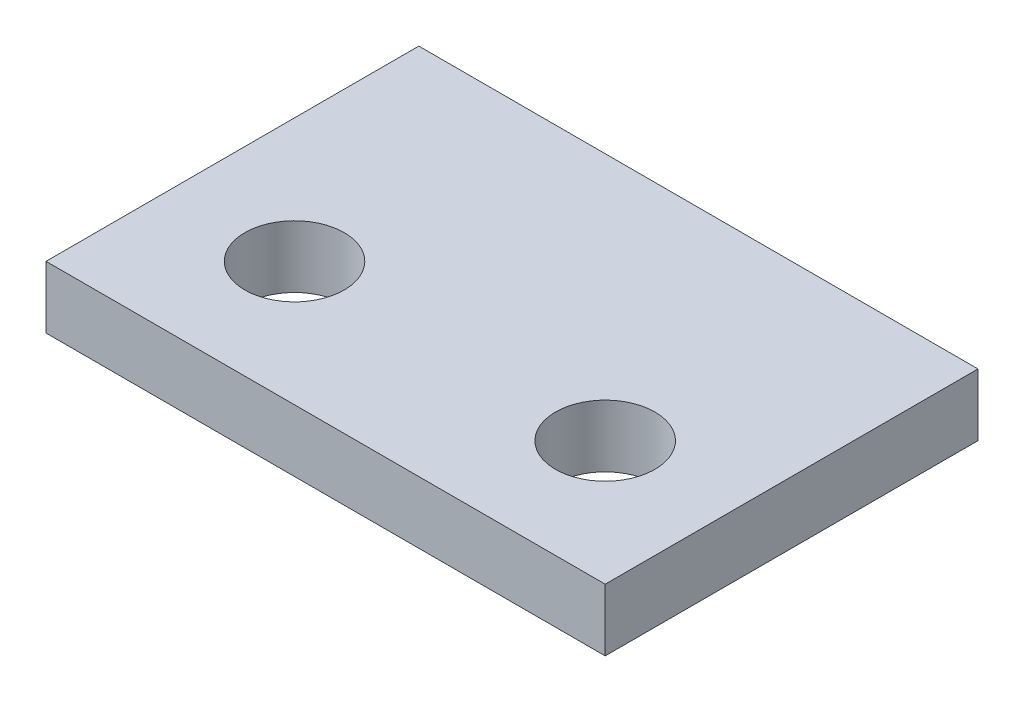
ISO-10303-21;
HEADER;
FILE_DESCRIPTION(('STEP AP214'),'2;1');
FILE_NAME('part.step','',(''),(''),'','','');
FILE_SCHEMA(('AUTOMOTIVE_DESIGN { 1 0 10303 214 1 1 1 1 }'));
ENDSEC;
DATA;
#1=APPLICATION_CONTEXT('core data for automotive mechanical design processes');
#2=APPLICATION_PROTOCOL_DEFINITION('international standard','automotive_design',2000,#1);
#3=PRODUCT_CONTEXT('',#1,'mechanical');
#4=PRODUCT('Part','Part','',(#3));
#5=PRODUCT_RELATED_PRODUCT_CATEGORY('part','',(#4));
#6=PRODUCT_DEFINITION_FORMATION('','',#4);
#7=PRODUCT_DEFINITION_CONTEXT('part definition',#1,'design');
#8=PRODUCT_DEFINITION('design','',#6,#7);
#9=PRODUCT_DEFINITION_SHAPE('','',#8);
#10=(LENGTH_UNIT() NAMED_UNIT(*) SI_UNIT(.MILLI.,.METRE.));
#11=(NAMED_UNIT(*) PLANE_ANGLE_UNIT() SI_UNIT($,.RADIAN.));
#12=(NAMED_UNIT(*) SI_UNIT($,.STERADIAN.) SOLID_ANGLE_UNIT());
#13=UNCERTAINTY_MEASURE_WITH_UNIT(LENGTH_MEASURE(1.E-05),#10,'distance_accuracy_value','');
#14=(GEOMETRIC_REPRESENTATION_CONTEXT(3) GLOBAL_UNCERTAINTY_ASSIGNED_CONTEXT((#13)) GLOBAL_UNIT_ASSIGNED_CONTEXT((#10,
#11,#12)) REPRESENTATION_CONTEXT('',''));
#15=CARTESIAN_POINT('',(0.,0.,0.));
#16=DIRECTION('',(0.,0.,1.));
#17=DIRECTION('',(1.,0.,0.));
#18=AXIS2_PLACEMENT_3D('',#15,#16,#17);
#19=CARTESIAN_POINT('',(0.,2.,0.));
#20=DIRECTION('',(0.,-1.,0.));
#21=DIRECTION('',(0.,0.,-1.));
#22=AXIS2_PLACEMENT_3D('',#19,#20,#21);
#23=PLANE('',#22);
#24=DIRECTION('',(0.,0.,-1.));
#25=VECTOR('',#24,1.);
#26=CARTESIAN_POINT('',(8.99999999999997,2.,4.));
#27=LINE('',#26,#25);
#28=CARTESIAN_POINT('',(8.99999999999997,2.,4.));
#29=VERTEX_POINT('',#28);
#30=CARTESIAN_POINT('',(9.00000000000003,2.,-8.));
#31=VERTEX_POINT('',#30);
#32=EDGE_CURVE('E89',#29,#31,#27,.T.);
#33=ORIENTED_EDGE('',*,*,#32,.T.);
#34=DIRECTION('',(-1.,0.,0.));
#35=VECTOR('',#34,1.);
#36=CARTESIAN_POINT('',(-8.99999999999997,2.,-8.));
#37=LINE('',#36,#35);
#38=CARTESIAN_POINT('',(-8.99999999999997,2.,-8.));
#39=VERTEX_POINT('',#38);
#40=EDGE_CURVE('E84',#31,#39,#37,.T.);
#41=ORIENTED_EDGE('',*,*,#40,.T.);
#42=DIRECTION('',(0.,0.,1.));
#43=VECTOR('',#42,1.);
#44=CARTESIAN_POINT('',(-8.99999999999997,2.,4.));
#45=LINE('',#44,#43);
#46=CARTESIAN_POINT('',(-8.99999999999997,2.,4.));
#47=VERTEX_POINT('',#46);
#48=EDGE_CURVE('E87',#39,#47,#45,.T.);
#49=ORIENTED_EDGE('',*,*,#48,.T.);
#50=DIRECTION('',(1.,0.,0.));
#51=VECTOR('',#50,1.);
#52=CARTESIAN_POINT('',(8.99999999999997,2.,4.));
#53=LINE('',#52,#51);
#54=EDGE_CURVE('E54',#47,#29,#53,.T.);
#55=ORIENTED_EDGE('',*,*,#54,.T.);
#56=EDGE_LOOP('',(#33,#41,#49,#55));
#57=FACE_BOUND('',#56,.T.);
#58=CARTESIAN_POINT('',(-4.99999999999995,2.,0.));
#59=DIRECTION('',(0.,1.,0.));
#60=DIRECTION('',(0.,0.,1.));
#61=AXIS2_PLACEMENT_3D('',#58,#59,#60);
#62=CIRCLE('',#61,1.6);
#63=CARTESIAN_POINT('',(-4.99999999999995,2.,1.6));
#64=VERTEX_POINT('',#63);
#65=EDGE_CURVE('E104',#64,#64,#62,.T.);
#66=ORIENTED_EDGE('',*,*,#65,.F.);
#67=EDGE_LOOP('',(#66));
#68=FACE_BOUND('',#67,.T.);
#69=CARTESIAN_POINT('',(4.99999999999995,2.,0.));
#70=DIRECTION('',(0.,1.,0.));
#71=DIRECTION('',(0.,0.,-1.));
#72=AXIS2_PLACEMENT_3D('',#69,#70,#71);
#73=CIRCLE('',#72,1.6);
#74=CARTESIAN_POINT('',(4.99999999999995,2.,-1.6));
#75=VERTEX_POINT('',#74);
#76=EDGE_CURVE('E119',#75,#75,#73,.T.);
#77=ORIENTED_EDGE('',*,*,#76,.F.);
#78=EDGE_LOOP('',(#77));
#79=FACE_BOUND('',#78,.T.);
#80=ADVANCED_FACE('F37',(#57,#68,#79),#23,.F.);
#81=CARTESIAN_POINT('',(0.,0.,0.));
#82=DIRECTION('',(0.,-1.,0.));
#83=DIRECTION('',(0.,0.,-1.));
#84=AXIS2_PLACEMENT_3D('',#81,#82,#83);
#85=PLANE('',#84);
#86=CARTESIAN_POINT('',(-4.99999999999995,0.,0.));
#87=DIRECTION('',(0.,1.,0.));
#88=DIRECTION('',(0.,0.,1.));
#89=AXIS2_PLACEMENT_3D('',#86,#87,#88);
#90=CIRCLE('',#89,1.6);
#91=CARTESIAN_POINT('',(-4.99999999999995,0.,1.6));
#92=VERTEX_POINT('',#91);
#93=EDGE_CURVE('E116',#92,#92,#90,.T.);
#94=ORIENTED_EDGE('',*,*,#93,.T.);
#95=EDGE_LOOP('',(#94));
#96=FACE_BOUND('',#95,.T.);
#97=DIRECTION('',(0.,0.,-1.));
#98=VECTOR('',#97,1.);
#99=CARTESIAN_POINT('',(8.99999999999997,0.,4.));
#100=LINE('',#99,#98);
#101=CARTESIAN_POINT('',(8.99999999999997,0.,4.));
#102=VERTEX_POINT('',#101);
#103=CARTESIAN_POINT('',(9.00000000000003,0.,-8.));
#104=VERTEX_POINT('',#103);
#105=EDGE_CURVE('E101',#102,#104,#100,.T.);
#106=ORIENTED_EDGE('',*,*,#105,.F.);
#107=DIRECTION('',(1.,0.,0.));
#108=VECTOR('',#107,1.);
#109=CARTESIAN_POINT('',(8.99999999999997,0.,4.));
#110=LINE('',#109,#108);
#111=CARTESIAN_POINT('',(-8.99999999999997,0.,4.));
#112=VERTEX_POINT('',#111);
#113=EDGE_CURVE('E77',#112,#102,#110,.T.);
#114=ORIENTED_EDGE('',*,*,#113,.F.);
#115=DIRECTION('',(0.,0.,1.));
#116=VECTOR('',#115,1.);
#117=CARTESIAN_POINT('',(-8.99999999999997,0.,4.));
#118=LINE('',#117,#116);
#119=CARTESIAN_POINT('',(-8.99999999999997,0.,-8.));
#120=VERTEX_POINT('',#119);
#121=EDGE_CURVE('E71',#120,#112,#118,.T.);
#122=ORIENTED_EDGE('',*,*,#121,.F.);
#123=DIRECTION('',(-1.,0.,0.));
#124=VECTOR('',#123,1.);
#125=CARTESIAN_POINT('',(-8.99999999999997,0.,-8.));
#126=LINE('',#125,#124);
#127=EDGE_CURVE('E93',#104,#120,#126,.T.);
#128=ORIENTED_EDGE('',*,*,#127,.F.);
#129=EDGE_LOOP('',(#106,#114,#122,#128));
#130=FACE_BOUND('',#129,.T.);
#131=CARTESIAN_POINT('',(4.99999999999995,0.,0.));
#132=DIRECTION('',(0.,1.,0.));
#133=DIRECTION('',(0.,0.,-1.));
#134=AXIS2_PLACEMENT_3D('',#131,#132,#133);
#135=CIRCLE('',#134,1.6);
#136=CARTESIAN_POINT('',(4.99999999999995,0.,-1.6));
#137=VERTEX_POINT('',#136);
#138=EDGE_CURVE('E122',#137,#137,#135,.T.);
#139=ORIENTED_EDGE('',*,*,#138,.T.);
#140=EDGE_LOOP('',(#139));
#141=FACE_BOUND('',#140,.T.);
#142=ADVANCED_FACE('F112',(#96,#130,#141),#85,.T.);
#143=CARTESIAN_POINT('',(8.99999999999997,2.,4.));
#144=DIRECTION('',(-1.,0.,0.));
#145=DIRECTION('',(0.,0.,1.));
#146=AXIS2_PLACEMENT_3D('',#143,#144,#145);
#147=PLANE('',#146);
#148=ORIENTED_EDGE('',*,*,#105,.T.);
#149=DIRECTION('',(0.,-1.,0.));
#150=VECTOR('',#149,1.);
#151=CARTESIAN_POINT('',(9.00000000000003,2.,-8.));
#152=LINE('',#151,#150);
#153=EDGE_CURVE('E11',#31,#104,#152,.T.);
#154=ORIENTED_EDGE('',*,*,#153,.F.);
#155=ORIENTED_EDGE('',*,*,#32,.F.);
#156=DIRECTION('',(0.,-1.,0.));
#157=VECTOR('',#156,1.);
#158=CARTESIAN_POINT('',(8.99999999999997,2.,4.));
#159=LINE('',#158,#157);
#160=EDGE_CURVE('E97',#29,#102,#159,.T.);
#161=ORIENTED_EDGE('',*,*,#160,.T.);
#162=EDGE_LOOP('',(#148,#154,#155,#161));
#163=FACE_BOUND('',#162,.T.);
#164=ADVANCED_FACE('F39',(#163),#147,.F.);
#165=CARTESIAN_POINT('',(-8.99999999999997,2.,-8.));
#166=DIRECTION('',(0.,0.,1.));
#167=DIRECTION('',(1.,0.,0.));
#168=AXIS2_PLACEMENT_3D('',#165,#166,#167);
#169=PLANE('',#168);
#170=ORIENTED_EDGE('',*,*,#127,.T.);
#171=DIRECTION('',(0.,-1.,0.));
#172=VECTOR('',#171,1.);
#173=CARTESIAN_POINT('',(-8.99999999999997,2.,-8.));
#174=LINE('',#173,#172);
#175=EDGE_CURVE('E46',#39,#120,#174,.T.);
#176=ORIENTED_EDGE('',*,*,#175,.F.);
#177=ORIENTED_EDGE('',*,*,#40,.F.);
#178=ORIENTED_EDGE('',*,*,#153,.T.);
#179=EDGE_LOOP('',(#170,#176,#177,#178));
#180=FACE_BOUND('',#179,.T.);
#181=ADVANCED_FACE('F92',(#180),#169,.F.);
#182=CARTESIAN_POINT('',(-8.99999999999997,2.,4.));
#183=DIRECTION('',(1.,0.,0.));
#184=DIRECTION('',(0.,0.,-1.));
#185=AXIS2_PLACEMENT_3D('',#182,#183,#184);
#186=PLANE('',#185);
#187=ORIENTED_EDGE('',*,*,#121,.T.);
#188=DIRECTION('',(0.,-1.,0.));
#189=VECTOR('',#188,1.);
#190=CARTESIAN_POINT('',(-8.99999999999997,2.,4.));
#191=LINE('',#190,#189);
#192=EDGE_CURVE('E94',#47,#112,#191,.T.);
#193=ORIENTED_EDGE('',*,*,#192,.F.);
#194=ORIENTED_EDGE('',*,*,#48,.F.);
#195=ORIENTED_EDGE('',*,*,#175,.T.);
#196=EDGE_LOOP('',(#187,#193,#194,#195));
#197=FACE_BOUND('',#196,.T.);
#198=ADVANCED_FACE('F95',(#197),#186,.F.);
#199=CARTESIAN_POINT('',(8.99999999999997,2.,4.));
#200=DIRECTION('',(0.,0.,-1.));
#201=DIRECTION('',(-1.,0.,0.));
#202=AXIS2_PLACEMENT_3D('',#199,#200,#201);
#203=PLANE('',#202);
#204=ORIENTED_EDGE('',*,*,#113,.T.);
#205=ORIENTED_EDGE('',*,*,#160,.F.);
#206=ORIENTED_EDGE('',*,*,#54,.F.);
#207=ORIENTED_EDGE('',*,*,#192,.T.);
#208=EDGE_LOOP('',(#204,#205,#206,#207));
#209=FACE_BOUND('',#208,.T.);
#210=ADVANCED_FACE('F109',(#209),#203,.F.);
#211=CARTESIAN_POINT('',(-4.99999999999995,2.,0.));
#212=DIRECTION('',(0.,-1.,0.));
#213=DIRECTION('',(0.,0.,-1.));
#214=AXIS2_PLACEMENT_3D('',#211,#212,#213);
#215=CYLINDRICAL_SURFACE('',#214,1.6);
#216=ORIENTED_EDGE('',*,*,#65,.T.);
#217=EDGE_LOOP('',(#216));
#218=FACE_BOUND('',#217,.T.);
#219=ORIENTED_EDGE('',*,*,#93,.F.);
#220=EDGE_LOOP('',(#219));
#221=FACE_BOUND('',#220,.T.);
#222=ADVANCED_FACE('F139',(#218,#221),#215,.F.);
#223=CARTESIAN_POINT('',(4.99999999999995,2.,0.));
#224=DIRECTION('',(0.,-1.,0.));
#225=DIRECTION('',(0.,0.,-1.));
#226=AXIS2_PLACEMENT_3D('',#223,#224,#225);
#227=CYLINDRICAL_SURFACE('',#226,1.6);
#228=ORIENTED_EDGE('',*,*,#76,.T.);
#229=EDGE_LOOP('',(#228));
#230=FACE_BOUND('',#229,.T.);
#231=ORIENTED_EDGE('',*,*,#138,.F.);
#232=EDGE_LOOP('',(#231));
#233=FACE_BOUND('',#232,.T.);
#234=ADVANCED_FACE('F128',(#230,#233),#227,.F.);
#235=CLOSED_SHELL('',(#80,#142,#164,#181,#198,#210,#222,#234));
#236=MANIFOLD_SOLID_BREP('B2',#235);
#237=ADVANCED_BREP_SHAPE_REPRESENTATION('',(#18,#236),#14);
#238=SHAPE_DEFINITION_REPRESENTATION(#9,#237);
ENDSEC;
END-ISO-10303-21;
